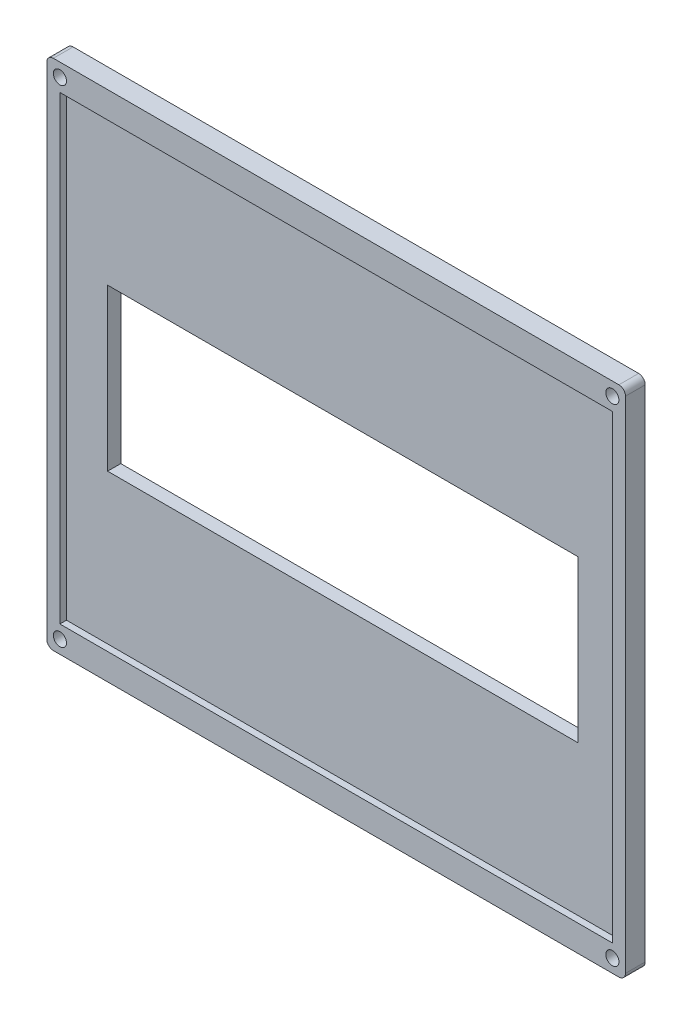
ISO-10303-21;
HEADER;
FILE_DESCRIPTION(('STEP AP214'),'2;1');
FILE_NAME('part.step','',(''),(''),'','','');
FILE_SCHEMA(('AUTOMOTIVE_DESIGN { 1 0 10303 214 1 1 1 1 }'));
ENDSEC;
DATA;
#1=APPLICATION_CONTEXT('core data for automotive mechanical design processes');
#2=APPLICATION_PROTOCOL_DEFINITION('international standard','automotive_design',2000,#1);
#3=PRODUCT_CONTEXT('',#1,'mechanical');
#4=PRODUCT('Part','Part','',(#3));
#5=PRODUCT_RELATED_PRODUCT_CATEGORY('part','',(#4));
#6=PRODUCT_DEFINITION_FORMATION('','',#4);
#7=PRODUCT_DEFINITION_CONTEXT('part definition',#1,'design');
#8=PRODUCT_DEFINITION('design','',#6,#7);
#9=PRODUCT_DEFINITION_SHAPE('','',#8);
#10=(LENGTH_UNIT() NAMED_UNIT(*) SI_UNIT(.MILLI.,.METRE.));
#11=(NAMED_UNIT(*) PLANE_ANGLE_UNIT() SI_UNIT($,.RADIAN.));
#12=(NAMED_UNIT(*) SI_UNIT($,.STERADIAN.) SOLID_ANGLE_UNIT());
#13=UNCERTAINTY_MEASURE_WITH_UNIT(LENGTH_MEASURE(1.E-05),#10,'distance_accuracy_value','');
#14=(GEOMETRIC_REPRESENTATION_CONTEXT(3) GLOBAL_UNCERTAINTY_ASSIGNED_CONTEXT((#13)) GLOBAL_UNIT_ASSIGNED_CONTEXT((#10,
#11,#12)) REPRESENTATION_CONTEXT('',''));
#15=CARTESIAN_POINT('',(0.,0.,0.));
#16=DIRECTION('',(0.,0.,1.));
#17=DIRECTION('',(1.,0.,0.));
#18=AXIS2_PLACEMENT_3D('',#15,#16,#17);
#19=CARTESIAN_POINT('',(-44.,-39.,3.));
#20=DIRECTION('',(0.,1.,0.));
#21=DIRECTION('',(0.,0.,1.));
#22=AXIS2_PLACEMENT_3D('',#19,#20,#21);
#23=PLANE('',#22);
#24=DIRECTION('',(1.,0.,0.));
#25=VECTOR('',#24,1.);
#26=CARTESIAN_POINT('',(-44.,-39.,0.));
#27=LINE('',#26,#25);
#28=CARTESIAN_POINT('',(-43.,-39.,0.));
#29=VERTEX_POINT('',#28);
#30=CARTESIAN_POINT('',(43.,-39.,0.));
#31=VERTEX_POINT('',#30);
#32=EDGE_CURVE('E262',#29,#31,#27,.T.);
#33=ORIENTED_EDGE('',*,*,#32,.T.);
#34=DIRECTION('',(0.,0.,-1.));
#35=VECTOR('',#34,1.);
#36=CARTESIAN_POINT('',(43.,-39.,3.));
#37=LINE('',#36,#35);
#38=CARTESIAN_POINT('',(43.,-39.,3.));
#39=VERTEX_POINT('',#38);
#40=EDGE_CURVE('E326',#31,#39,#37,.F.);
#41=ORIENTED_EDGE('',*,*,#40,.T.);
#42=DIRECTION('',(1.,0.,0.));
#43=VECTOR('',#42,1.);
#44=CARTESIAN_POINT('',(-44.,-39.,3.));
#45=LINE('',#44,#43);
#46=CARTESIAN_POINT('',(-43.,-39.,3.));
#47=VERTEX_POINT('',#46);
#48=EDGE_CURVE('E272',#47,#39,#45,.T.);
#49=ORIENTED_EDGE('',*,*,#48,.F.);
#50=DIRECTION('',(0.,0.,-1.));
#51=VECTOR('',#50,1.);
#52=CARTESIAN_POINT('',(-43.,-39.,3.));
#53=LINE('',#52,#51);
#54=EDGE_CURVE('E322',#47,#29,#53,.T.);
#55=ORIENTED_EDGE('',*,*,#54,.T.);
#56=EDGE_LOOP('',(#33,#41,#49,#55));
#57=FACE_BOUND('',#56,.T.);
#58=ADVANCED_FACE('F45',(#57),#23,.F.);
#59=CARTESIAN_POINT('',(44.,39.,3.));
#60=DIRECTION('',(1.,0.,0.));
#61=DIRECTION('',(0.,0.,-1.));
#62=AXIS2_PLACEMENT_3D('',#59,#60,#61);
#63=PLANE('',#62);
#64=DIRECTION('',(0.,-1.,0.));
#65=VECTOR('',#64,1.);
#66=CARTESIAN_POINT('',(44.,39.,3.));
#67=LINE('',#66,#65);
#68=CARTESIAN_POINT('',(44.,38.,3.));
#69=VERTEX_POINT('',#68);
#70=CARTESIAN_POINT('',(44.,-38.,3.));
#71=VERTEX_POINT('',#70);
#72=EDGE_CURVE('E276',#69,#71,#67,.T.);
#73=ORIENTED_EDGE('',*,*,#72,.T.);
#74=DIRECTION('',(0.,0.,-1.));
#75=VECTOR('',#74,1.);
#76=CARTESIAN_POINT('',(44.,-38.,0.));
#77=LINE('',#76,#75);
#78=CARTESIAN_POINT('',(44.,-38.,0.));
#79=VERTEX_POINT('',#78);
#80=EDGE_CURVE('E306',#71,#79,#77,.T.);
#81=ORIENTED_EDGE('',*,*,#80,.T.);
#82=DIRECTION('',(0.,-1.,0.));
#83=VECTOR('',#82,1.);
#84=CARTESIAN_POINT('',(44.,39.,0.));
#85=LINE('',#84,#83);
#86=CARTESIAN_POINT('',(44.,38.,0.));
#87=VERTEX_POINT('',#86);
#88=EDGE_CURVE('E293',#87,#79,#85,.T.);
#89=ORIENTED_EDGE('',*,*,#88,.F.);
#90=DIRECTION('',(0.,0.,-1.));
#91=VECTOR('',#90,1.);
#92=CARTESIAN_POINT('',(44.,38.,3.));
#93=LINE('',#92,#91);
#94=EDGE_CURVE('E289',#87,#69,#93,.F.);
#95=ORIENTED_EDGE('',*,*,#94,.T.);
#96=EDGE_LOOP('',(#73,#81,#89,#95));
#97=FACE_BOUND('',#96,.T.);
#98=ADVANCED_FACE('F384',(#97),#63,.T.);
#99=CARTESIAN_POINT('',(-44.,39.,3.));
#100=DIRECTION('',(0.,1.,0.));
#101=DIRECTION('',(0.,0.,1.));
#102=AXIS2_PLACEMENT_3D('',#99,#100,#101);
#103=PLANE('',#102);
#104=DIRECTION('',(1.,0.,0.));
#105=VECTOR('',#104,1.);
#106=CARTESIAN_POINT('',(-44.,39.,3.));
#107=LINE('',#106,#105);
#108=CARTESIAN_POINT('',(-43.,39.,3.));
#109=VERTEX_POINT('',#108);
#110=CARTESIAN_POINT('',(43.,39.,3.));
#111=VERTEX_POINT('',#110);
#112=EDGE_CURVE('E281',#109,#111,#107,.T.);
#113=ORIENTED_EDGE('',*,*,#112,.T.);
#114=DIRECTION('',(0.,0.,-1.));
#115=VECTOR('',#114,1.);
#116=CARTESIAN_POINT('',(43.,39.,3.));
#117=LINE('',#116,#115);
#118=CARTESIAN_POINT('',(43.,39.,0.));
#119=VERTEX_POINT('',#118);
#120=EDGE_CURVE('E351',#111,#119,#117,.T.);
#121=ORIENTED_EDGE('',*,*,#120,.T.);
#122=DIRECTION('',(1.,0.,0.));
#123=VECTOR('',#122,1.);
#124=CARTESIAN_POINT('',(-44.,39.,0.));
#125=LINE('',#124,#123);
#126=CARTESIAN_POINT('',(-43.,39.,0.));
#127=VERTEX_POINT('',#126);
#128=EDGE_CURVE('E297',#127,#119,#125,.T.);
#129=ORIENTED_EDGE('',*,*,#128,.F.);
#130=DIRECTION('',(0.,0.,-1.));
#131=VECTOR('',#130,1.);
#132=CARTESIAN_POINT('',(-43.,39.,3.));
#133=LINE('',#132,#131);
#134=EDGE_CURVE('E348',#127,#109,#133,.F.);
#135=ORIENTED_EDGE('',*,*,#134,.T.);
#136=EDGE_LOOP('',(#113,#121,#129,#135));
#137=FACE_BOUND('',#136,.T.);
#138=ADVANCED_FACE('F395',(#137),#103,.T.);
#139=CARTESIAN_POINT('',(-44.,39.,3.));
#140=DIRECTION('',(1.,0.,0.));
#141=DIRECTION('',(0.,1.,0.));
#142=AXIS2_PLACEMENT_3D('',#139,#140,#141);
#143=PLANE('',#142);
#144=DIRECTION('',(0.,-1.,0.));
#145=VECTOR('',#144,1.);
#146=CARTESIAN_POINT('',(-44.,39.,0.));
#147=LINE('',#146,#145);
#148=CARTESIAN_POINT('',(-44.,38.,0.));
#149=VERTEX_POINT('',#148);
#150=CARTESIAN_POINT('',(-44.,-38.,0.));
#151=VERTEX_POINT('',#150);
#152=EDGE_CURVE('E277',#149,#151,#147,.T.);
#153=ORIENTED_EDGE('',*,*,#152,.T.);
#154=DIRECTION('',(0.,0.,-1.));
#155=VECTOR('',#154,1.);
#156=CARTESIAN_POINT('',(-44.,-38.,3.));
#157=LINE('',#156,#155);
#158=CARTESIAN_POINT('',(-44.,-38.,3.));
#159=VERTEX_POINT('',#158);
#160=EDGE_CURVE('E345',#151,#159,#157,.F.);
#161=ORIENTED_EDGE('',*,*,#160,.T.);
#162=DIRECTION('',(0.,-1.,0.));
#163=VECTOR('',#162,1.);
#164=CARTESIAN_POINT('',(-44.,39.,3.));
#165=LINE('',#164,#163);
#166=CARTESIAN_POINT('',(-44.,38.,3.));
#167=VERTEX_POINT('',#166);
#168=EDGE_CURVE('E285',#167,#159,#165,.T.);
#169=ORIENTED_EDGE('',*,*,#168,.F.);
#170=DIRECTION('',(0.,0.,-1.));
#171=VECTOR('',#170,1.);
#172=CARTESIAN_POINT('',(-44.,38.,0.));
#173=LINE('',#172,#171);
#174=EDGE_CURVE('E341',#167,#149,#173,.T.);
#175=ORIENTED_EDGE('',*,*,#174,.T.);
#176=EDGE_LOOP('',(#153,#161,#169,#175));
#177=FACE_BOUND('',#176,.T.);
#178=ADVANCED_FACE('F403',(#177),#143,.F.);
#179=CARTESIAN_POINT('',(0.,0.,3.));
#180=DIRECTION('',(0.,0.,-1.));
#181=DIRECTION('',(-1.,0.,0.));
#182=AXIS2_PLACEMENT_3D('',#179,#180,#181);
#183=PLANE('',#182);
#184=CARTESIAN_POINT('',(42.,37.,3.));
#185=DIRECTION('',(0.,0.,1.));
#186=DIRECTION('',(1.,0.,0.));
#187=AXIS2_PLACEMENT_3D('',#184,#185,#186);
#188=CIRCLE('',#187,0.999999999999998);
#189=CARTESIAN_POINT('',(43.,37.,3.));
#190=VERTEX_POINT('',#189);
#191=EDGE_CURVE('E204',#190,#190,#188,.T.);
#192=ORIENTED_EDGE('',*,*,#191,.F.);
#193=EDGE_LOOP('',(#192));
#194=FACE_BOUND('',#193,.T.);
#195=CARTESIAN_POINT('',(-42.,-37.,3.));
#196=DIRECTION('',(0.,0.,1.));
#197=DIRECTION('',(1.,0.,0.));
#198=AXIS2_PLACEMENT_3D('',#195,#196,#197);
#199=CIRCLE('',#198,0.999999999999998);
#200=CARTESIAN_POINT('',(-41.,-37.,3.));
#201=VERTEX_POINT('',#200);
#202=EDGE_CURVE('E213',#201,#201,#199,.T.);
#203=ORIENTED_EDGE('',*,*,#202,.F.);
#204=EDGE_LOOP('',(#203));
#205=FACE_BOUND('',#204,.T.);
#206=CARTESIAN_POINT('',(42.,-37.,3.));
#207=DIRECTION('',(0.,0.,1.));
#208=DIRECTION('',(1.,0.,0.));
#209=AXIS2_PLACEMENT_3D('',#206,#207,#208);
#210=CIRCLE('',#209,0.999999999999998);
#211=CARTESIAN_POINT('',(43.,-37.,3.));
#212=VERTEX_POINT('',#211);
#213=EDGE_CURVE('E196',#212,#212,#210,.T.);
#214=ORIENTED_EDGE('',*,*,#213,.F.);
#215=EDGE_LOOP('',(#214));
#216=FACE_BOUND('',#215,.T.);
#217=CARTESIAN_POINT('',(-42.,37.,3.));
#218=DIRECTION('',(0.,0.,1.));
#219=DIRECTION('',(1.,0.,0.));
#220=AXIS2_PLACEMENT_3D('',#217,#218,#219);
#221=CIRCLE('',#220,0.999999999999998);
#222=CARTESIAN_POINT('',(-41.,37.,3.));
#223=VERTEX_POINT('',#222);
#224=EDGE_CURVE('E208',#223,#223,#221,.T.);
#225=ORIENTED_EDGE('',*,*,#224,.F.);
#226=EDGE_LOOP('',(#225));
#227=FACE_BOUND('',#226,.T.);
#228=DIRECTION('',(-1.,0.,0.));
#229=VECTOR('',#228,1.);
#230=CARTESIAN_POINT('',(-42.,35.,3.));
#231=LINE('',#230,#229);
#232=CARTESIAN_POINT('',(42.,35.,3.));
#233=VERTEX_POINT('',#232);
#234=CARTESIAN_POINT('',(-42.,35.,3.));
#235=VERTEX_POINT('',#234);
#236=EDGE_CURVE('E248',#233,#235,#231,.T.);
#237=ORIENTED_EDGE('',*,*,#236,.F.);
#238=DIRECTION('',(0.,1.,0.));
#239=VECTOR('',#238,1.);
#240=CARTESIAN_POINT('',(42.,35.,3.));
#241=LINE('',#240,#239);
#242=CARTESIAN_POINT('',(42.,-35.,3.));
#243=VERTEX_POINT('',#242);
#244=EDGE_CURVE('E224',#243,#233,#241,.T.);
#245=ORIENTED_EDGE('',*,*,#244,.F.);
#246=DIRECTION('',(1.,0.,0.));
#247=VECTOR('',#246,1.);
#248=CARTESIAN_POINT('',(-42.,-35.,3.));
#249=LINE('',#248,#247);
#250=CARTESIAN_POINT('',(-42.,-35.,3.));
#251=VERTEX_POINT('',#250);
#252=EDGE_CURVE('E233',#251,#243,#249,.T.);
#253=ORIENTED_EDGE('',*,*,#252,.F.);
#254=DIRECTION('',(0.,-1.,0.));
#255=VECTOR('',#254,1.);
#256=CARTESIAN_POINT('',(-42.,35.,3.));
#257=LINE('',#256,#255);
#258=EDGE_CURVE('E252',#235,#251,#257,.T.);
#259=ORIENTED_EDGE('',*,*,#258,.F.);
#260=EDGE_LOOP('',(#237,#245,#253,#259));
#261=FACE_BOUND('',#260,.T.);
#262=ORIENTED_EDGE('',*,*,#48,.T.);
#263=CARTESIAN_POINT('',(43.,-38.,3.));
#264=DIRECTION('',(0.,0.,-1.));
#265=DIRECTION('',(-1.,0.,0.));
#266=AXIS2_PLACEMENT_3D('',#263,#264,#265);
#267=CIRCLE('',#266,1.);
#268=EDGE_CURVE('E338',#39,#71,#267,.F.);
#269=ORIENTED_EDGE('',*,*,#268,.T.);
#270=ORIENTED_EDGE('',*,*,#72,.F.);
#271=CARTESIAN_POINT('',(43.,38.,3.));
#272=DIRECTION('',(0.,0.,-1.));
#273=DIRECTION('',(-1.,0.,0.));
#274=AXIS2_PLACEMENT_3D('',#271,#272,#273);
#275=CIRCLE('',#274,1.);
#276=EDGE_CURVE('E332',#69,#111,#275,.F.);
#277=ORIENTED_EDGE('',*,*,#276,.T.);
#278=ORIENTED_EDGE('',*,*,#112,.F.);
#279=CARTESIAN_POINT('',(-43.,38.,3.));
#280=DIRECTION('',(0.,0.,-1.));
#281=DIRECTION('',(-1.,0.,0.));
#282=AXIS2_PLACEMENT_3D('',#279,#280,#281);
#283=CIRCLE('',#282,1.);
#284=EDGE_CURVE('E329',#109,#167,#283,.F.);
#285=ORIENTED_EDGE('',*,*,#284,.T.);
#286=ORIENTED_EDGE('',*,*,#168,.T.);
#287=CARTESIAN_POINT('',(-43.,-38.,3.));
#288=DIRECTION('',(0.,0.,-1.));
#289=DIRECTION('',(-1.,0.,0.));
#290=AXIS2_PLACEMENT_3D('',#287,#288,#289);
#291=CIRCLE('',#290,1.);
#292=EDGE_CURVE('E335',#159,#47,#291,.F.);
#293=ORIENTED_EDGE('',*,*,#292,.T.);
#294=EDGE_LOOP('',(#262,#269,#270,#277,#278,#285,#286,#293));
#295=FACE_BOUND('',#294,.T.);
#296=ADVANCED_FACE('F370',(#194,#205,#216,#227,#261,#295),#183,.F.);
#297=CARTESIAN_POINT('',(0.,0.,0.));
#298=DIRECTION('',(0.,0.,-1.));
#299=DIRECTION('',(-1.,0.,0.));
#300=AXIS2_PLACEMENT_3D('',#297,#298,#299);
#301=PLANE('',#300);
#302=DIRECTION('',(0.,-1.,0.));
#303=VECTOR('',#302,1.);
#304=CARTESIAN_POINT('',(35.75,0.,0.));
#305=LINE('',#304,#303);
#306=CARTESIAN_POINT('',(35.75,12.25,0.));
#307=VERTEX_POINT('',#306);
#308=CARTESIAN_POINT('',(35.75,-12.25,0.));
#309=VERTEX_POINT('',#308);
#310=EDGE_CURVE('E11',#307,#309,#305,.T.);
#311=ORIENTED_EDGE('',*,*,#310,.F.);
#312=DIRECTION('',(1.,0.,0.));
#313=VECTOR('',#312,1.);
#314=CARTESIAN_POINT('',(0.,12.25,0.));
#315=LINE('',#314,#313);
#316=CARTESIAN_POINT('',(-35.75,12.25,0.));
#317=VERTEX_POINT('',#316);
#318=EDGE_CURVE('E163',#317,#307,#315,.T.);
#319=ORIENTED_EDGE('',*,*,#318,.F.);
#320=DIRECTION('',(0.,1.,0.));
#321=VECTOR('',#320,1.);
#322=CARTESIAN_POINT('',(-35.75,0.,0.));
#323=LINE('',#322,#321);
#324=CARTESIAN_POINT('',(-35.75,-12.25,0.));
#325=VERTEX_POINT('',#324);
#326=EDGE_CURVE('E357',#325,#317,#323,.T.);
#327=ORIENTED_EDGE('',*,*,#326,.F.);
#328=DIRECTION('',(-1.,0.,0.));
#329=VECTOR('',#328,1.);
#330=CARTESIAN_POINT('',(0.,-12.25,0.));
#331=LINE('',#330,#329);
#332=EDGE_CURVE('E54',#309,#325,#331,.T.);
#333=ORIENTED_EDGE('',*,*,#332,.F.);
#334=EDGE_LOOP('',(#311,#319,#327,#333));
#335=FACE_BOUND('',#334,.T.);
#336=CARTESIAN_POINT('',(42.,37.,0.));
#337=DIRECTION('',(0.,0.,1.));
#338=DIRECTION('',(1.,0.,0.));
#339=AXIS2_PLACEMENT_3D('',#336,#337,#338);
#340=CIRCLE('',#339,0.999999999999998);
#341=CARTESIAN_POINT('',(43.,37.,0.));
#342=VERTEX_POINT('',#341);
#343=EDGE_CURVE('E209',#342,#342,#340,.T.);
#344=ORIENTED_EDGE('',*,*,#343,.T.);
#345=EDGE_LOOP('',(#344));
#346=FACE_BOUND('',#345,.T.);
#347=CARTESIAN_POINT('',(-42.,-37.,0.));
#348=DIRECTION('',(0.,0.,1.));
#349=DIRECTION('',(1.,0.,0.));
#350=AXIS2_PLACEMENT_3D('',#347,#348,#349);
#351=CIRCLE('',#350,0.999999999999998);
#352=CARTESIAN_POINT('',(-41.,-37.,0.));
#353=VERTEX_POINT('',#352);
#354=EDGE_CURVE('E200',#353,#353,#351,.T.);
#355=ORIENTED_EDGE('',*,*,#354,.T.);
#356=EDGE_LOOP('',(#355));
#357=FACE_BOUND('',#356,.T.);
#358=CARTESIAN_POINT('',(42.,-37.,0.));
#359=DIRECTION('',(0.,0.,1.));
#360=DIRECTION('',(1.,0.,0.));
#361=AXIS2_PLACEMENT_3D('',#358,#359,#360);
#362=CIRCLE('',#361,0.999999999999998);
#363=CARTESIAN_POINT('',(43.,-37.,0.));
#364=VERTEX_POINT('',#363);
#365=EDGE_CURVE('E190',#364,#364,#362,.T.);
#366=ORIENTED_EDGE('',*,*,#365,.T.);
#367=EDGE_LOOP('',(#366));
#368=FACE_BOUND('',#367,.T.);
#369=CARTESIAN_POINT('',(-42.,37.,0.));
#370=DIRECTION('',(0.,0.,1.));
#371=DIRECTION('',(1.,0.,0.));
#372=AXIS2_PLACEMENT_3D('',#369,#370,#371);
#373=CIRCLE('',#372,0.999999999999998);
#374=CARTESIAN_POINT('',(-41.,37.,0.));
#375=VERTEX_POINT('',#374);
#376=EDGE_CURVE('E220',#375,#375,#373,.T.);
#377=ORIENTED_EDGE('',*,*,#376,.T.);
#378=EDGE_LOOP('',(#377));
#379=FACE_BOUND('',#378,.T.);
#380=ORIENTED_EDGE('',*,*,#88,.T.);
#381=CARTESIAN_POINT('',(43.,-38.,0.));
#382=DIRECTION('',(0.,0.,-1.));
#383=DIRECTION('',(-1.,0.,0.));
#384=AXIS2_PLACEMENT_3D('',#381,#382,#383);
#385=CIRCLE('',#384,1.);
#386=EDGE_CURVE('E319',#79,#31,#385,.T.);
#387=ORIENTED_EDGE('',*,*,#386,.T.);
#388=ORIENTED_EDGE('',*,*,#32,.F.);
#389=CARTESIAN_POINT('',(-43.,-38.,0.));
#390=DIRECTION('',(0.,0.,-1.));
#391=DIRECTION('',(-1.,0.,0.));
#392=AXIS2_PLACEMENT_3D('',#389,#390,#391);
#393=CIRCLE('',#392,1.);
#394=EDGE_CURVE('E316',#29,#151,#393,.T.);
#395=ORIENTED_EDGE('',*,*,#394,.T.);
#396=ORIENTED_EDGE('',*,*,#152,.F.);
#397=CARTESIAN_POINT('',(-43.,38.,0.));
#398=DIRECTION('',(0.,0.,-1.));
#399=DIRECTION('',(-1.,0.,0.));
#400=AXIS2_PLACEMENT_3D('',#397,#398,#399);
#401=CIRCLE('',#400,1.);
#402=EDGE_CURVE('E310',#149,#127,#401,.T.);
#403=ORIENTED_EDGE('',*,*,#402,.T.);
#404=ORIENTED_EDGE('',*,*,#128,.T.);
#405=CARTESIAN_POINT('',(43.,38.,0.));
#406=DIRECTION('',(0.,0.,-1.));
#407=DIRECTION('',(-1.,0.,0.));
#408=AXIS2_PLACEMENT_3D('',#405,#406,#407);
#409=CIRCLE('',#408,1.);
#410=EDGE_CURVE('E313',#119,#87,#409,.T.);
#411=ORIENTED_EDGE('',*,*,#410,.T.);
#412=EDGE_LOOP('',(#380,#387,#388,#395,#396,#403,#404,#411));
#413=FACE_BOUND('',#412,.T.);
#414=ADVANCED_FACE('F366',(#335,#346,#357,#368,#379,#413),#301,.T.);
#415=CARTESIAN_POINT('',(42.,35.,2.));
#416=DIRECTION('',(1.,0.,0.));
#417=DIRECTION('',(0.,1.,0.));
#418=AXIS2_PLACEMENT_3D('',#415,#416,#417);
#419=PLANE('',#418);
#420=ORIENTED_EDGE('',*,*,#244,.T.);
#421=DIRECTION('',(0.,0.,1.));
#422=VECTOR('',#421,1.);
#423=CARTESIAN_POINT('',(42.,35.,2.));
#424=LINE('',#423,#422);
#425=CARTESIAN_POINT('',(42.,35.,2.));
#426=VERTEX_POINT('',#425);
#427=EDGE_CURVE('E245',#426,#233,#424,.T.);
#428=ORIENTED_EDGE('',*,*,#427,.F.);
#429=DIRECTION('',(0.,1.,0.));
#430=VECTOR('',#429,1.);
#431=CARTESIAN_POINT('',(42.,35.,2.));
#432=LINE('',#431,#430);
#433=CARTESIAN_POINT('',(42.,-35.,2.));
#434=VERTEX_POINT('',#433);
#435=EDGE_CURVE('E228',#434,#426,#432,.T.);
#436=ORIENTED_EDGE('',*,*,#435,.F.);
#437=DIRECTION('',(0.,0.,1.));
#438=VECTOR('',#437,1.);
#439=CARTESIAN_POINT('',(42.,-35.,2.));
#440=LINE('',#439,#438);
#441=EDGE_CURVE('E259',#434,#243,#440,.T.);
#442=ORIENTED_EDGE('',*,*,#441,.T.);
#443=EDGE_LOOP('',(#420,#428,#436,#442));
#444=FACE_BOUND('',#443,.T.);
#445=ADVANCED_FACE('F369',(#444),#419,.F.);
#446=CARTESIAN_POINT('',(-42.,-35.,2.));
#447=DIRECTION('',(0.,-1.,0.));
#448=DIRECTION('',(0.,0.,-1.));
#449=AXIS2_PLACEMENT_3D('',#446,#447,#448);
#450=PLANE('',#449);
#451=ORIENTED_EDGE('',*,*,#252,.T.);
#452=ORIENTED_EDGE('',*,*,#441,.F.);
#453=DIRECTION('',(1.,0.,0.));
#454=VECTOR('',#453,1.);
#455=CARTESIAN_POINT('',(-42.,-35.,2.));
#456=LINE('',#455,#454);
#457=CARTESIAN_POINT('',(-42.,-35.,2.));
#458=VERTEX_POINT('',#457);
#459=EDGE_CURVE('E241',#458,#434,#456,.T.);
#460=ORIENTED_EDGE('',*,*,#459,.F.);
#461=DIRECTION('',(0.,0.,1.));
#462=VECTOR('',#461,1.);
#463=CARTESIAN_POINT('',(-42.,-35.,2.));
#464=LINE('',#463,#462);
#465=EDGE_CURVE('E263',#458,#251,#464,.T.);
#466=ORIENTED_EDGE('',*,*,#465,.T.);
#467=EDGE_LOOP('',(#451,#452,#460,#466));
#468=FACE_BOUND('',#467,.T.);
#469=ADVANCED_FACE('F442',(#468),#450,.F.);
#470=CARTESIAN_POINT('',(-42.,35.,2.));
#471=DIRECTION('',(-1.,0.,0.));
#472=DIRECTION('',(0.,-1.,0.));
#473=AXIS2_PLACEMENT_3D('',#470,#471,#472);
#474=PLANE('',#473);
#475=ORIENTED_EDGE('',*,*,#258,.T.);
#476=ORIENTED_EDGE('',*,*,#465,.F.);
#477=DIRECTION('',(0.,-1.,0.));
#478=VECTOR('',#477,1.);
#479=CARTESIAN_POINT('',(-42.,35.,2.));
#480=LINE('',#479,#478);
#481=CARTESIAN_POINT('',(-42.,35.,2.));
#482=VERTEX_POINT('',#481);
#483=EDGE_CURVE('E237',#482,#458,#480,.T.);
#484=ORIENTED_EDGE('',*,*,#483,.F.);
#485=DIRECTION('',(0.,0.,1.));
#486=VECTOR('',#485,1.);
#487=CARTESIAN_POINT('',(-42.,35.,2.));
#488=LINE('',#487,#486);
#489=EDGE_CURVE('E266',#482,#235,#488,.T.);
#490=ORIENTED_EDGE('',*,*,#489,.T.);
#491=EDGE_LOOP('',(#475,#476,#484,#490));
#492=FACE_BOUND('',#491,.T.);
#493=ADVANCED_FACE('F447',(#492),#474,.F.);
#494=CARTESIAN_POINT('',(-42.,35.,2.));
#495=DIRECTION('',(0.,1.,0.));
#496=DIRECTION('',(0.,0.,1.));
#497=AXIS2_PLACEMENT_3D('',#494,#495,#496);
#498=PLANE('',#497);
#499=ORIENTED_EDGE('',*,*,#236,.T.);
#500=ORIENTED_EDGE('',*,*,#489,.F.);
#501=DIRECTION('',(-1.,0.,0.));
#502=VECTOR('',#501,1.);
#503=CARTESIAN_POINT('',(-42.,35.,2.));
#504=LINE('',#503,#502);
#505=EDGE_CURVE('E232',#426,#482,#504,.T.);
#506=ORIENTED_EDGE('',*,*,#505,.F.);
#507=ORIENTED_EDGE('',*,*,#427,.T.);
#508=EDGE_LOOP('',(#499,#500,#506,#507));
#509=FACE_BOUND('',#508,.T.);
#510=ADVANCED_FACE('F444',(#509),#498,.F.);
#511=CARTESIAN_POINT('',(0.,0.,2.));
#512=DIRECTION('',(0.,0.,1.));
#513=DIRECTION('',(1.,0.,0.));
#514=AXIS2_PLACEMENT_3D('',#511,#512,#513);
#515=PLANE('',#514);
#516=DIRECTION('',(0.,1.,0.));
#517=VECTOR('',#516,1.);
#518=CARTESIAN_POINT('',(35.75,12.25,2.));
#519=LINE('',#518,#517);
#520=CARTESIAN_POINT('',(35.75,-12.25,2.));
#521=VERTEX_POINT('',#520);
#522=CARTESIAN_POINT('',(35.75,12.25,2.));
#523=VERTEX_POINT('',#522);
#524=EDGE_CURVE('E170',#521,#523,#519,.T.);
#525=ORIENTED_EDGE('',*,*,#524,.F.);
#526=DIRECTION('',(1.,0.,0.));
#527=VECTOR('',#526,1.);
#528=CARTESIAN_POINT('',(-35.75,-12.25,2.));
#529=LINE('',#528,#527);
#530=CARTESIAN_POINT('',(-35.75,-12.25,2.));
#531=VERTEX_POINT('',#530);
#532=EDGE_CURVE('E167',#531,#521,#529,.T.);
#533=ORIENTED_EDGE('',*,*,#532,.F.);
#534=DIRECTION('',(0.,-1.,0.));
#535=VECTOR('',#534,1.);
#536=CARTESIAN_POINT('',(-35.75,12.25,2.));
#537=LINE('',#536,#535);
#538=CARTESIAN_POINT('',(-35.75,12.25,2.));
#539=VERTEX_POINT('',#538);
#540=EDGE_CURVE('E61',#539,#531,#537,.T.);
#541=ORIENTED_EDGE('',*,*,#540,.F.);
#542=DIRECTION('',(-1.,0.,0.));
#543=VECTOR('',#542,1.);
#544=CARTESIAN_POINT('',(-35.75,12.25,2.));
#545=LINE('',#544,#543);
#546=EDGE_CURVE('E161',#523,#539,#545,.T.);
#547=ORIENTED_EDGE('',*,*,#546,.F.);
#548=EDGE_LOOP('',(#525,#533,#541,#547));
#549=FACE_BOUND('',#548,.T.);
#550=ORIENTED_EDGE('',*,*,#435,.T.);
#551=ORIENTED_EDGE('',*,*,#505,.T.);
#552=ORIENTED_EDGE('',*,*,#483,.T.);
#553=ORIENTED_EDGE('',*,*,#459,.T.);
#554=EDGE_LOOP('',(#550,#551,#552,#553));
#555=FACE_BOUND('',#554,.T.);
#556=ADVANCED_FACE('F179',(#549,#555),#515,.T.);
#557=CARTESIAN_POINT('',(-42.,37.,0.));
#558=DIRECTION('',(0.,0.,1.));
#559=DIRECTION('',(1.,0.,0.));
#560=AXIS2_PLACEMENT_3D('',#557,#558,#559);
#561=CYLINDRICAL_SURFACE('',#560,0.999999999999998);
#562=ORIENTED_EDGE('',*,*,#376,.F.);
#563=EDGE_LOOP('',(#562));
#564=FACE_BOUND('',#563,.T.);
#565=ORIENTED_EDGE('',*,*,#224,.T.);
#566=EDGE_LOOP('',(#565));
#567=FACE_BOUND('',#566,.T.);
#568=ADVANCED_FACE('F457',(#564,#567),#561,.F.);
#569=CARTESIAN_POINT('',(42.,-37.,0.));
#570=DIRECTION('',(0.,0.,1.));
#571=DIRECTION('',(1.,0.,0.));
#572=AXIS2_PLACEMENT_3D('',#569,#570,#571);
#573=CYLINDRICAL_SURFACE('',#572,0.999999999999998);
#574=ORIENTED_EDGE('',*,*,#365,.F.);
#575=EDGE_LOOP('',(#574));
#576=FACE_BOUND('',#575,.T.);
#577=ORIENTED_EDGE('',*,*,#213,.T.);
#578=EDGE_LOOP('',(#577));
#579=FACE_BOUND('',#578,.T.);
#580=ADVANCED_FACE('F460',(#576,#579),#573,.F.);
#581=CARTESIAN_POINT('',(-42.,-37.,0.));
#582=DIRECTION('',(0.,0.,1.));
#583=DIRECTION('',(1.,0.,0.));
#584=AXIS2_PLACEMENT_3D('',#581,#582,#583);
#585=CYLINDRICAL_SURFACE('',#584,0.999999999999998);
#586=ORIENTED_EDGE('',*,*,#354,.F.);
#587=EDGE_LOOP('',(#586));
#588=FACE_BOUND('',#587,.T.);
#589=ORIENTED_EDGE('',*,*,#202,.T.);
#590=EDGE_LOOP('',(#589));
#591=FACE_BOUND('',#590,.T.);
#592=ADVANCED_FACE('F424',(#588,#591),#585,.F.);
#593=CARTESIAN_POINT('',(42.,37.,0.));
#594=DIRECTION('',(0.,0.,1.));
#595=DIRECTION('',(1.,0.,0.));
#596=AXIS2_PLACEMENT_3D('',#593,#594,#595);
#597=CYLINDRICAL_SURFACE('',#596,0.999999999999998);
#598=ORIENTED_EDGE('',*,*,#343,.F.);
#599=EDGE_LOOP('',(#598));
#600=FACE_BOUND('',#599,.T.);
#601=ORIENTED_EDGE('',*,*,#191,.T.);
#602=EDGE_LOOP('',(#601));
#603=FACE_BOUND('',#602,.T.);
#604=ADVANCED_FACE('F416',(#600,#603),#597,.F.);
#605=CARTESIAN_POINT('',(43.,-38.,3.));
#606=DIRECTION('',(0.,0.,1.));
#607=DIRECTION('',(1.,0.,0.));
#608=AXIS2_PLACEMENT_3D('',#605,#606,#607);
#609=CYLINDRICAL_SURFACE('',#608,1.);
#610=ORIENTED_EDGE('',*,*,#268,.F.);
#611=ORIENTED_EDGE('',*,*,#40,.F.);
#612=ORIENTED_EDGE('',*,*,#386,.F.);
#613=ORIENTED_EDGE('',*,*,#80,.F.);
#614=EDGE_LOOP('',(#610,#611,#612,#613));
#615=FACE_BOUND('',#614,.T.);
#616=ADVANCED_FACE('F414',(#615),#609,.T.);
#617=CARTESIAN_POINT('',(-43.,-38.,3.));
#618=DIRECTION('',(0.,0.,-1.));
#619=DIRECTION('',(-1.,0.,0.));
#620=AXIS2_PLACEMENT_3D('',#617,#618,#619);
#621=CYLINDRICAL_SURFACE('',#620,1.);
#622=ORIENTED_EDGE('',*,*,#292,.F.);
#623=ORIENTED_EDGE('',*,*,#160,.F.);
#624=ORIENTED_EDGE('',*,*,#394,.F.);
#625=ORIENTED_EDGE('',*,*,#54,.F.);
#626=EDGE_LOOP('',(#622,#623,#624,#625));
#627=FACE_BOUND('',#626,.T.);
#628=ADVANCED_FACE('F407',(#627),#621,.T.);
#629=CARTESIAN_POINT('',(43.,38.,3.));
#630=DIRECTION('',(0.,0.,-1.));
#631=DIRECTION('',(-1.,0.,0.));
#632=AXIS2_PLACEMENT_3D('',#629,#630,#631);
#633=CYLINDRICAL_SURFACE('',#632,1.);
#634=ORIENTED_EDGE('',*,*,#276,.F.);
#635=ORIENTED_EDGE('',*,*,#94,.F.);
#636=ORIENTED_EDGE('',*,*,#410,.F.);
#637=ORIENTED_EDGE('',*,*,#120,.F.);
#638=EDGE_LOOP('',(#634,#635,#636,#637));
#639=FACE_BOUND('',#638,.T.);
#640=ADVANCED_FACE('F389',(#639),#633,.T.);
#641=CARTESIAN_POINT('',(-43.,38.,3.));
#642=DIRECTION('',(0.,0.,1.));
#643=DIRECTION('',(1.,0.,0.));
#644=AXIS2_PLACEMENT_3D('',#641,#642,#643);
#645=CYLINDRICAL_SURFACE('',#644,1.);
#646=ORIENTED_EDGE('',*,*,#284,.F.);
#647=ORIENTED_EDGE('',*,*,#134,.F.);
#648=ORIENTED_EDGE('',*,*,#402,.F.);
#649=ORIENTED_EDGE('',*,*,#174,.F.);
#650=EDGE_LOOP('',(#646,#647,#648,#649));
#651=FACE_BOUND('',#650,.T.);
#652=ADVANCED_FACE('F47',(#651),#645,.T.);
#653=CARTESIAN_POINT('',(35.75,12.25,-1.));
#654=DIRECTION('',(1.,0.,0.));
#655=DIRECTION('',(0.,0.,-1.));
#656=AXIS2_PLACEMENT_3D('',#653,#654,#655);
#657=PLANE('',#656);
#658=ORIENTED_EDGE('',*,*,#310,.T.);
#659=DIRECTION('',(0.,0.,1.));
#660=VECTOR('',#659,1.);
#661=CARTESIAN_POINT('',(35.75,-12.25,-1.));
#662=LINE('',#661,#660);
#663=EDGE_CURVE('E173',#309,#521,#662,.T.);
#664=ORIENTED_EDGE('',*,*,#663,.T.);
#665=ORIENTED_EDGE('',*,*,#524,.T.);
#666=DIRECTION('',(0.,0.,1.));
#667=VECTOR('',#666,1.);
#668=CARTESIAN_POINT('',(35.75,12.25,-1.));
#669=LINE('',#668,#667);
#670=EDGE_CURVE('E157',#307,#523,#669,.T.);
#671=ORIENTED_EDGE('',*,*,#670,.F.);
#672=EDGE_LOOP('',(#658,#664,#665,#671));
#673=FACE_BOUND('',#672,.T.);
#674=ADVANCED_FACE('F171',(#673),#657,.F.);
#675=CARTESIAN_POINT('',(-35.75,-12.25,-1.));
#676=DIRECTION('',(0.,-1.,0.));
#677=DIRECTION('',(0.,0.,-1.));
#678=AXIS2_PLACEMENT_3D('',#675,#676,#677);
#679=PLANE('',#678);
#680=ORIENTED_EDGE('',*,*,#332,.T.);
#681=DIRECTION('',(0.,0.,1.));
#682=VECTOR('',#681,1.);
#683=CARTESIAN_POINT('',(-35.75,-12.25,-1.));
#684=LINE('',#683,#682);
#685=EDGE_CURVE('E191',#325,#531,#684,.T.);
#686=ORIENTED_EDGE('',*,*,#685,.T.);
#687=ORIENTED_EDGE('',*,*,#532,.T.);
#688=ORIENTED_EDGE('',*,*,#663,.F.);
#689=EDGE_LOOP('',(#680,#686,#687,#688));
#690=FACE_BOUND('',#689,.T.);
#691=ADVANCED_FACE('F362',(#690),#679,.F.);
#692=CARTESIAN_POINT('',(-35.75,12.25,-1.));
#693=DIRECTION('',(-1.,0.,0.));
#694=DIRECTION('',(0.,0.,1.));
#695=AXIS2_PLACEMENT_3D('',#692,#693,#694);
#696=PLANE('',#695);
#697=ORIENTED_EDGE('',*,*,#326,.T.);
#698=DIRECTION('',(0.,0.,1.));
#699=VECTOR('',#698,1.);
#700=CARTESIAN_POINT('',(-35.75,12.25,-1.));
#701=LINE('',#700,#699);
#702=EDGE_CURVE('E68',#317,#539,#701,.T.);
#703=ORIENTED_EDGE('',*,*,#702,.T.);
#704=ORIENTED_EDGE('',*,*,#540,.T.);
#705=ORIENTED_EDGE('',*,*,#685,.F.);
#706=EDGE_LOOP('',(#697,#703,#704,#705));
#707=FACE_BOUND('',#706,.T.);
#708=ADVANCED_FACE('F365',(#707),#696,.F.);
#709=CARTESIAN_POINT('',(-35.75,12.25,-1.));
#710=DIRECTION('',(0.,1.,0.));
#711=DIRECTION('',(0.,0.,1.));
#712=AXIS2_PLACEMENT_3D('',#709,#710,#711);
#713=PLANE('',#712);
#714=ORIENTED_EDGE('',*,*,#318,.T.);
#715=ORIENTED_EDGE('',*,*,#670,.T.);
#716=ORIENTED_EDGE('',*,*,#546,.T.);
#717=ORIENTED_EDGE('',*,*,#702,.F.);
#718=EDGE_LOOP('',(#714,#715,#716,#717));
#719=FACE_BOUND('',#718,.T.);
#720=ADVANCED_FACE('F159',(#719),#713,.F.);
#721=CLOSED_SHELL('',(#58,#98,#138,#178,#296,#414,#445,#469,#493,#510,#556,#568,#580,#592,#604,
#616,#628,#640,#652,#674,#691,#708,#720));
#722=MANIFOLD_SOLID_BREP('B2',#721);
#723=ADVANCED_BREP_SHAPE_REPRESENTATION('',(#18,#722),#14);
#724=SHAPE_DEFINITION_REPRESENTATION(#9,#723);
ENDSEC;
END-ISO-10303-21;
